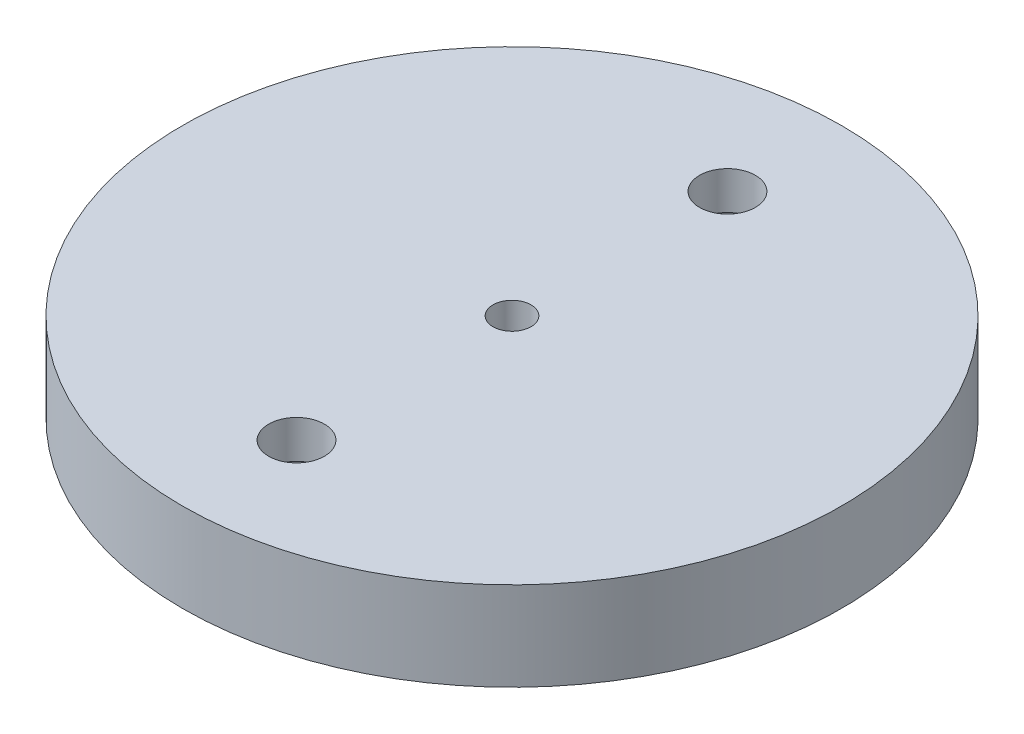
ISO-10303-21;
HEADER;
FILE_DESCRIPTION(('STEP AP214'),'2;1');
FILE_NAME('part.step','',(''),(''),'','','');
FILE_SCHEMA(('AUTOMOTIVE_DESIGN { 1 0 10303 214 1 1 1 1 }'));
ENDSEC;
DATA;
#1=APPLICATION_CONTEXT('core data for automotive mechanical design processes');
#2=APPLICATION_PROTOCOL_DEFINITION('international standard','automotive_design',2000,#1);
#3=PRODUCT_CONTEXT('',#1,'mechanical');
#4=PRODUCT('Part','Part','',(#3));
#5=PRODUCT_RELATED_PRODUCT_CATEGORY('part','',(#4));
#6=PRODUCT_DEFINITION_FORMATION('','',#4);
#7=PRODUCT_DEFINITION_CONTEXT('part definition',#1,'design');
#8=PRODUCT_DEFINITION('design','',#6,#7);
#9=PRODUCT_DEFINITION_SHAPE('','',#8);
#10=(LENGTH_UNIT() NAMED_UNIT(*) SI_UNIT(.MILLI.,.METRE.));
#11=(NAMED_UNIT(*) PLANE_ANGLE_UNIT() SI_UNIT($,.RADIAN.));
#12=(NAMED_UNIT(*) SI_UNIT($,.STERADIAN.) SOLID_ANGLE_UNIT());
#13=UNCERTAINTY_MEASURE_WITH_UNIT(LENGTH_MEASURE(1.E-05),#10,'distance_accuracy_value','');
#14=(GEOMETRIC_REPRESENTATION_CONTEXT(3) GLOBAL_UNCERTAINTY_ASSIGNED_CONTEXT((#13)) GLOBAL_UNIT_ASSIGNED_CONTEXT((#10,
#11,#12)) REPRESENTATION_CONTEXT('',''));
#15=CARTESIAN_POINT('',(0.,0.,0.));
#16=DIRECTION('',(0.,0.,1.));
#17=DIRECTION('',(1.,0.,0.));
#18=AXIS2_PLACEMENT_3D('',#15,#16,#17);
#19=CARTESIAN_POINT('',(0.,0.,0.));
#20=DIRECTION('',(0.,1.,0.));
#21=DIRECTION('',(0.,0.,1.));
#22=AXIS2_PLACEMENT_3D('',#19,#20,#21);
#23=PLANE('',#22);
#24=CARTESIAN_POINT('',(0.,0.,0.));
#25=DIRECTION('',(0.,1.,0.));
#26=DIRECTION('',(0.,0.,1.));
#27=AXIS2_PLACEMENT_3D('',#24,#25,#26);
#28=CIRCLE('',#27,13.);
#29=CARTESIAN_POINT('',(0.,0.,13.));
#30=VERTEX_POINT('',#29);
#31=EDGE_CURVE('E10',#30,#30,#28,.T.);
#32=ORIENTED_EDGE('',*,*,#31,.F.);
#33=EDGE_LOOP('',(#32));
#34=FACE_BOUND('',#33,.T.);
#35=CARTESIAN_POINT('',(0.,0.,0.));
#36=DIRECTION('',(0.,1.,0.));
#37=DIRECTION('',(0.,0.,1.));
#38=AXIS2_PLACEMENT_3D('',#35,#36,#37);
#39=CIRCLE('',#38,1.65);
#40=CARTESIAN_POINT('',(0.,0.,1.65));
#41=VERTEX_POINT('',#40);
#42=EDGE_CURVE('E44',#41,#41,#39,.T.);
#43=ORIENTED_EDGE('',*,*,#42,.T.);
#44=EDGE_LOOP('',(#43));
#45=FACE_BOUND('',#44,.T.);
#46=CARTESIAN_POINT('',(0.,0.,-8.5));
#47=DIRECTION('',(0.,1.,0.));
#48=DIRECTION('',(0.,0.,1.));
#49=AXIS2_PLACEMENT_3D('',#46,#47,#48);
#50=CIRCLE('',#49,2.5);
#51=CARTESIAN_POINT('',(0.,0.,-6.));
#52=VERTEX_POINT('',#51);
#53=EDGE_CURVE('E48',#52,#52,#50,.T.);
#54=ORIENTED_EDGE('',*,*,#53,.T.);
#55=EDGE_LOOP('',(#54));
#56=FACE_BOUND('',#55,.T.);
#57=CARTESIAN_POINT('',(0.,0.,8.5));
#58=DIRECTION('',(0.,1.,0.));
#59=DIRECTION('',(0.,0.,1.));
#60=AXIS2_PLACEMENT_3D('',#57,#58,#59);
#61=CIRCLE('',#60,2.5);
#62=CARTESIAN_POINT('',(0.,0.,11.));
#63=VERTEX_POINT('',#62);
#64=EDGE_CURVE('E52',#63,#63,#61,.T.);
#65=ORIENTED_EDGE('',*,*,#64,.T.);
#66=EDGE_LOOP('',(#65));
#67=FACE_BOUND('',#66,.T.);
#68=ADVANCED_FACE('F37',(#34,#45,#56,#67),#23,.F.);
#69=CARTESIAN_POINT('',(0.,2.,0.));
#70=DIRECTION('',(0.,-1.,0.));
#71=DIRECTION('',(0.,0.,-1.));
#72=AXIS2_PLACEMENT_3D('',#69,#70,#71);
#73=CYLINDRICAL_SURFACE('',#72,13.);
#74=ORIENTED_EDGE('',*,*,#31,.T.);
#75=EDGE_LOOP('',(#74));
#76=FACE_BOUND('',#75,.T.);
#77=CARTESIAN_POINT('',(0.,3.5,0.));
#78=DIRECTION('',(0.,1.,0.));
#79=DIRECTION('',(0.,0.,1.));
#80=AXIS2_PLACEMENT_3D('',#77,#78,#79);
#81=CIRCLE('',#80,13.);
#82=CARTESIAN_POINT('',(0.,3.5,13.));
#83=VERTEX_POINT('',#82);
#84=EDGE_CURVE('E66',#83,#83,#81,.T.);
#85=ORIENTED_EDGE('',*,*,#84,.F.);
#86=EDGE_LOOP('',(#85));
#87=FACE_BOUND('',#86,.T.);
#88=ADVANCED_FACE('F39',(#76,#87),#73,.T.);
#89=CARTESIAN_POINT('',(0.,2.,0.));
#90=DIRECTION('',(0.,-1.,0.));
#91=DIRECTION('',(0.,0.,-1.));
#92=AXIS2_PLACEMENT_3D('',#89,#90,#91);
#93=CYLINDRICAL_SURFACE('',#92,1.65);
#94=CARTESIAN_POINT('',(0.,2.,0.));
#95=DIRECTION('',(0.,1.,0.));
#96=DIRECTION('',(0.,0.,1.));
#97=AXIS2_PLACEMENT_3D('',#94,#95,#96);
#98=CIRCLE('',#97,1.65);
#99=CARTESIAN_POINT('',(0.,2.,1.65));
#100=VERTEX_POINT('',#99);
#101=EDGE_CURVE('E55',#100,#100,#98,.T.);
#102=ORIENTED_EDGE('',*,*,#101,.T.);
#103=EDGE_LOOP('',(#102));
#104=FACE_BOUND('',#103,.T.);
#105=ORIENTED_EDGE('',*,*,#42,.F.);
#106=EDGE_LOOP('',(#105));
#107=FACE_BOUND('',#106,.T.);
#108=ADVANCED_FACE('F116',(#104,#107),#93,.F.);
#109=CARTESIAN_POINT('',(0.,2.,-8.5));
#110=DIRECTION('',(0.,-1.,0.));
#111=DIRECTION('',(0.,0.,-1.));
#112=AXIS2_PLACEMENT_3D('',#109,#110,#111);
#113=CYLINDRICAL_SURFACE('',#112,2.5);
#114=CARTESIAN_POINT('',(0.,2.,-8.5));
#115=DIRECTION('',(0.,1.,0.));
#116=DIRECTION('',(0.,0.,1.));
#117=AXIS2_PLACEMENT_3D('',#114,#115,#116);
#118=CIRCLE('',#117,2.5);
#119=CARTESIAN_POINT('',(0.,2.,-6.));
#120=VERTEX_POINT('',#119);
#121=EDGE_CURVE('E57',#120,#120,#118,.T.);
#122=ORIENTED_EDGE('',*,*,#121,.T.);
#123=EDGE_LOOP('',(#122));
#124=FACE_BOUND('',#123,.T.);
#125=ORIENTED_EDGE('',*,*,#53,.F.);
#126=EDGE_LOOP('',(#125));
#127=FACE_BOUND('',#126,.T.);
#128=ADVANCED_FACE('F119',(#124,#127),#113,.F.);
#129=CARTESIAN_POINT('',(0.,2.,8.5));
#130=DIRECTION('',(0.,-1.,0.));
#131=DIRECTION('',(0.,0.,-1.));
#132=AXIS2_PLACEMENT_3D('',#129,#130,#131);
#133=CYLINDRICAL_SURFACE('',#132,2.5);
#134=CARTESIAN_POINT('',(0.,2.,8.5));
#135=DIRECTION('',(0.,1.,0.));
#136=DIRECTION('',(0.,0.,1.));
#137=AXIS2_PLACEMENT_3D('',#134,#135,#136);
#138=CIRCLE('',#137,2.5);
#139=CARTESIAN_POINT('',(0.,2.,11.));
#140=VERTEX_POINT('',#139);
#141=EDGE_CURVE('E58',#140,#140,#138,.T.);
#142=ORIENTED_EDGE('',*,*,#141,.T.);
#143=EDGE_LOOP('',(#142));
#144=FACE_BOUND('',#143,.T.);
#145=ORIENTED_EDGE('',*,*,#64,.F.);
#146=EDGE_LOOP('',(#145));
#147=FACE_BOUND('',#146,.T.);
#148=ADVANCED_FACE('F123',(#144,#147),#133,.F.);
#149=CARTESIAN_POINT('',(0.,2.,0.));
#150=DIRECTION('',(0.,1.,0.));
#151=DIRECTION('',(0.,0.,1.));
#152=AXIS2_PLACEMENT_3D('',#149,#150,#151);
#153=PLANE('',#152);
#154=CARTESIAN_POINT('',(0.,2.,-8.5));
#155=DIRECTION('',(0.,1.,0.));
#156=DIRECTION('',(0.,0.,1.));
#157=AXIS2_PLACEMENT_3D('',#154,#155,#156);
#158=CIRCLE('',#157,1.1);
#159=CARTESIAN_POINT('',(0.,2.,-7.4));
#160=VERTEX_POINT('',#159);
#161=EDGE_CURVE('E76',#160,#160,#158,.T.);
#162=ORIENTED_EDGE('',*,*,#161,.T.);
#163=EDGE_LOOP('',(#162));
#164=FACE_BOUND('',#163,.T.);
#165=ORIENTED_EDGE('',*,*,#121,.F.);
#166=EDGE_LOOP('',(#165));
#167=FACE_BOUND('',#166,.T.);
#168=ADVANCED_FACE('F107',(#164,#167),#153,.F.);
#169=CARTESIAN_POINT('',(0.,2.,0.));
#170=DIRECTION('',(0.,1.,0.));
#171=DIRECTION('',(0.,0.,1.));
#172=AXIS2_PLACEMENT_3D('',#169,#170,#171);
#173=CIRCLE('',#172,0.75);
#174=CARTESIAN_POINT('',(0.,2.,0.75));
#175=VERTEX_POINT('',#174);
#176=EDGE_CURVE('E70',#175,#175,#173,.T.);
#177=ORIENTED_EDGE('',*,*,#176,.T.);
#178=EDGE_LOOP('',(#177));
#179=FACE_BOUND('',#178,.T.);
#180=ORIENTED_EDGE('',*,*,#101,.F.);
#181=EDGE_LOOP('',(#180));
#182=FACE_BOUND('',#181,.T.);
#183=ADVANCED_FACE('F104',(#179,#182),#153,.F.);
#184=CARTESIAN_POINT('',(0.,2.,8.5));
#185=DIRECTION('',(0.,1.,0.));
#186=DIRECTION('',(0.,0.,1.));
#187=AXIS2_PLACEMENT_3D('',#184,#185,#186);
#188=CIRCLE('',#187,1.1);
#189=CARTESIAN_POINT('',(0.,2.,9.6));
#190=VERTEX_POINT('',#189);
#191=EDGE_CURVE('E82',#190,#190,#188,.T.);
#192=ORIENTED_EDGE('',*,*,#191,.T.);
#193=EDGE_LOOP('',(#192));
#194=FACE_BOUND('',#193,.T.);
#195=ORIENTED_EDGE('',*,*,#141,.F.);
#196=EDGE_LOOP('',(#195));
#197=FACE_BOUND('',#196,.T.);
#198=ADVANCED_FACE('F94',(#194,#197),#153,.F.);
#199=CARTESIAN_POINT('',(0.,3.5,0.));
#200=DIRECTION('',(0.,1.,0.));
#201=DIRECTION('',(0.,0.,1.));
#202=AXIS2_PLACEMENT_3D('',#199,#200,#201);
#203=PLANE('',#202);
#204=CARTESIAN_POINT('',(0.,3.5,-8.5));
#205=DIRECTION('',(0.,1.,0.));
#206=DIRECTION('',(0.,0.,1.));
#207=AXIS2_PLACEMENT_3D('',#204,#205,#206);
#208=CIRCLE('',#207,1.1);
#209=CARTESIAN_POINT('',(0.,3.5,-7.4));
#210=VERTEX_POINT('',#209);
#211=EDGE_CURVE('E73',#210,#210,#208,.T.);
#212=ORIENTED_EDGE('',*,*,#211,.F.);
#213=EDGE_LOOP('',(#212));
#214=FACE_BOUND('',#213,.T.);
#215=ORIENTED_EDGE('',*,*,#84,.T.);
#216=EDGE_LOOP('',(#215));
#217=FACE_BOUND('',#216,.T.);
#218=CARTESIAN_POINT('',(0.,3.5,0.));
#219=DIRECTION('',(0.,1.,0.));
#220=DIRECTION('',(0.,0.,1.));
#221=AXIS2_PLACEMENT_3D('',#218,#219,#220);
#222=CIRCLE('',#221,0.75);
#223=CARTESIAN_POINT('',(0.,3.5,0.75));
#224=VERTEX_POINT('',#223);
#225=EDGE_CURVE('E69',#224,#224,#222,.T.);
#226=ORIENTED_EDGE('',*,*,#225,.F.);
#227=EDGE_LOOP('',(#226));
#228=FACE_BOUND('',#227,.T.);
#229=CARTESIAN_POINT('',(0.,3.5,8.5));
#230=DIRECTION('',(0.,1.,0.));
#231=DIRECTION('',(0.,0.,1.));
#232=AXIS2_PLACEMENT_3D('',#229,#230,#231);
#233=CIRCLE('',#232,1.1);
#234=CARTESIAN_POINT('',(0.,3.5,9.6));
#235=VERTEX_POINT('',#234);
#236=EDGE_CURVE('E79',#235,#235,#233,.T.);
#237=ORIENTED_EDGE('',*,*,#236,.F.);
#238=EDGE_LOOP('',(#237));
#239=FACE_BOUND('',#238,.T.);
#240=ADVANCED_FACE('F91',(#214,#217,#228,#239),#203,.T.);
#241=CARTESIAN_POINT('',(0.,3.5,0.));
#242=DIRECTION('',(0.,-1.,0.));
#243=DIRECTION('',(0.,0.,-1.));
#244=AXIS2_PLACEMENT_3D('',#241,#242,#243);
#245=CYLINDRICAL_SURFACE('',#244,0.75);
#246=ORIENTED_EDGE('',*,*,#225,.T.);
#247=EDGE_LOOP('',(#246));
#248=FACE_BOUND('',#247,.T.);
#249=ORIENTED_EDGE('',*,*,#176,.F.);
#250=EDGE_LOOP('',(#249));
#251=FACE_BOUND('',#250,.T.);
#252=ADVANCED_FACE('F93',(#248,#251),#245,.F.);
#253=CARTESIAN_POINT('',(0.,3.5,-8.5));
#254=DIRECTION('',(0.,-1.,0.));
#255=DIRECTION('',(0.,0.,-1.));
#256=AXIS2_PLACEMENT_3D('',#253,#254,#255);
#257=CYLINDRICAL_SURFACE('',#256,1.1);
#258=ORIENTED_EDGE('',*,*,#211,.T.);
#259=EDGE_LOOP('',(#258));
#260=FACE_BOUND('',#259,.T.);
#261=ORIENTED_EDGE('',*,*,#161,.F.);
#262=EDGE_LOOP('',(#261));
#263=FACE_BOUND('',#262,.T.);
#264=ADVANCED_FACE('F101',(#260,#263),#257,.F.);
#265=CARTESIAN_POINT('',(0.,3.5,8.5));
#266=DIRECTION('',(0.,-1.,0.));
#267=DIRECTION('',(0.,0.,-1.));
#268=AXIS2_PLACEMENT_3D('',#265,#266,#267);
#269=CYLINDRICAL_SURFACE('',#268,1.1);
#270=ORIENTED_EDGE('',*,*,#236,.T.);
#271=EDGE_LOOP('',(#270));
#272=FACE_BOUND('',#271,.T.);
#273=ORIENTED_EDGE('',*,*,#191,.F.);
#274=EDGE_LOOP('',(#273));
#275=FACE_BOUND('',#274,.T.);
#276=ADVANCED_FACE('F88',(#272,#275),#269,.F.);
#277=CLOSED_SHELL('',(#68,#88,#108,#128,#148,#168,#183,#198,#240,#252,#264,#276));
#278=MANIFOLD_SOLID_BREP('B2',#277);
#279=ADVANCED_BREP_SHAPE_REPRESENTATION('',(#18,#278),#14);
#280=SHAPE_DEFINITION_REPRESENTATION(#9,#279);
ENDSEC;
END-ISO-10303-21;
